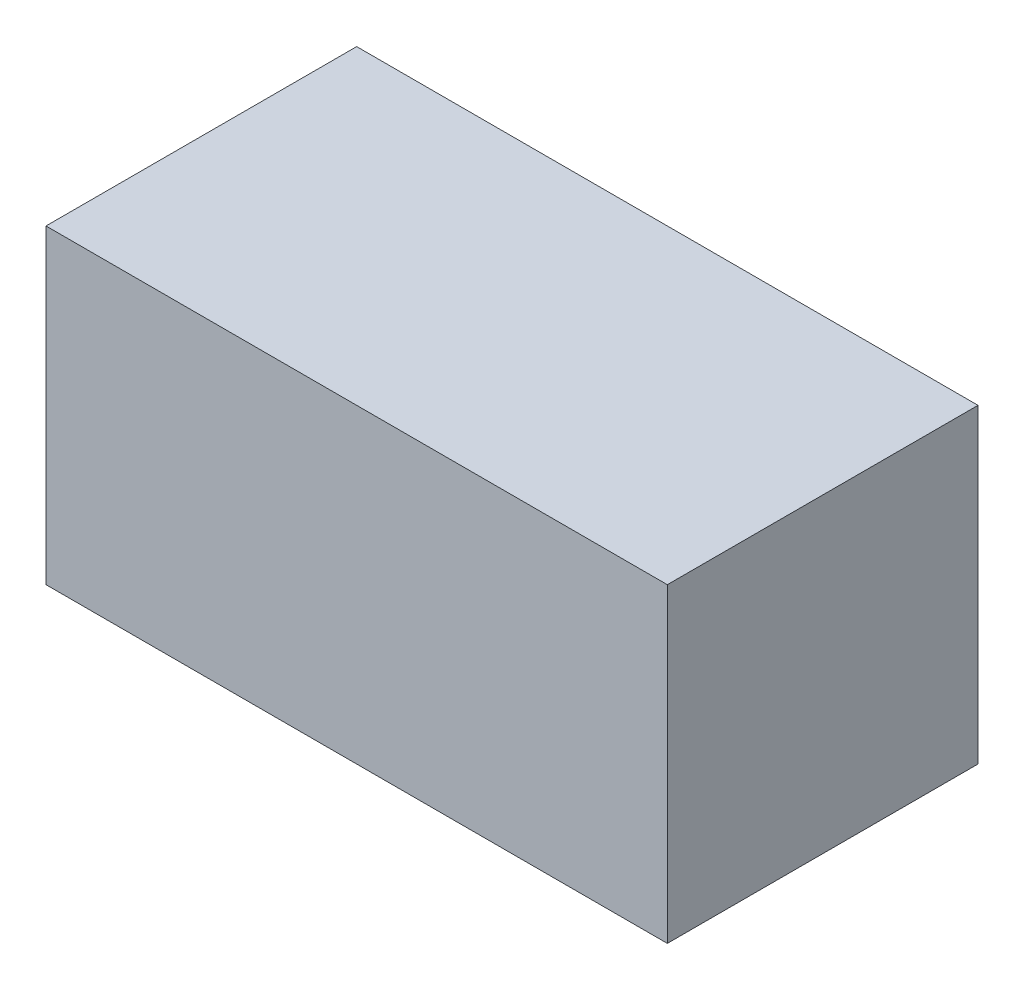
ISO-10303-21;
HEADER;
FILE_DESCRIPTION(('STEP AP214'),'2;1');
FILE_NAME('part.step','',(''),(''),'','','');
FILE_SCHEMA(('AUTOMOTIVE_DESIGN { 1 0 10303 214 1 1 1 1 }'));
ENDSEC;
DATA;
#1=APPLICATION_CONTEXT('core data for automotive mechanical design processes');
#2=APPLICATION_PROTOCOL_DEFINITION('international standard','automotive_design',2000,#1);
#3=PRODUCT_CONTEXT('',#1,'mechanical');
#4=PRODUCT('Part','Part','',(#3));
#5=PRODUCT_RELATED_PRODUCT_CATEGORY('part','',(#4));
#6=PRODUCT_DEFINITION_FORMATION('','',#4);
#7=PRODUCT_DEFINITION_CONTEXT('part definition',#1,'design');
#8=PRODUCT_DEFINITION('design','',#6,#7);
#9=PRODUCT_DEFINITION_SHAPE('','',#8);
#10=(LENGTH_UNIT() NAMED_UNIT(*) SI_UNIT(.MILLI.,.METRE.));
#11=(NAMED_UNIT(*) PLANE_ANGLE_UNIT() SI_UNIT($,.RADIAN.));
#12=(NAMED_UNIT(*) SI_UNIT($,.STERADIAN.) SOLID_ANGLE_UNIT());
#13=UNCERTAINTY_MEASURE_WITH_UNIT(LENGTH_MEASURE(1.E-05),#10,'distance_accuracy_value','');
#14=(GEOMETRIC_REPRESENTATION_CONTEXT(3) GLOBAL_UNCERTAINTY_ASSIGNED_CONTEXT((#13)) GLOBAL_UNIT_ASSIGNED_CONTEXT((#10,
#11,#12)) REPRESENTATION_CONTEXT('',''));
#15=CARTESIAN_POINT('',(0.,0.,0.));
#16=DIRECTION('',(0.,0.,1.));
#17=DIRECTION('',(1.,0.,0.));
#18=AXIS2_PLACEMENT_3D('',#15,#16,#17);
#19=CARTESIAN_POINT('',(6.35,-3.175,6.35));
#20=DIRECTION('',(-1.,0.,0.));
#21=DIRECTION('',(0.,0.,1.));
#22=AXIS2_PLACEMENT_3D('',#19,#20,#21);
#23=PLANE('',#22);
#24=DIRECTION('',(0.,1.,0.));
#25=VECTOR('',#24,1.);
#26=CARTESIAN_POINT('',(6.35,-3.175,0.));
#27=LINE('',#26,#25);
#28=CARTESIAN_POINT('',(6.35,-3.175,0.));
#29=VERTEX_POINT('',#28);
#30=CARTESIAN_POINT('',(6.35,3.175,0.));
#31=VERTEX_POINT('',#30);
#32=EDGE_CURVE('E96',#29,#31,#27,.T.);
#33=ORIENTED_EDGE('',*,*,#32,.T.);
#34=DIRECTION('',(0.,0.,-1.));
#35=VECTOR('',#34,1.);
#36=CARTESIAN_POINT('',(6.35,3.175,6.35));
#37=LINE('',#36,#35);
#38=CARTESIAN_POINT('',(6.35,3.175,6.35));
#39=VERTEX_POINT('',#38);
#40=EDGE_CURVE('E11',#39,#31,#37,.T.);
#41=ORIENTED_EDGE('',*,*,#40,.F.);
#42=DIRECTION('',(0.,1.,0.));
#43=VECTOR('',#42,1.);
#44=CARTESIAN_POINT('',(6.35,-3.175,6.35));
#45=LINE('',#44,#43);
#46=CARTESIAN_POINT('',(6.35,-3.175,6.35));
#47=VERTEX_POINT('',#46);
#48=EDGE_CURVE('E84',#47,#39,#45,.T.);
#49=ORIENTED_EDGE('',*,*,#48,.F.);
#50=DIRECTION('',(0.,0.,-1.));
#51=VECTOR('',#50,1.);
#52=CARTESIAN_POINT('',(6.35,-3.175,6.35));
#53=LINE('',#52,#51);
#54=EDGE_CURVE('E92',#47,#29,#53,.T.);
#55=ORIENTED_EDGE('',*,*,#54,.T.);
#56=EDGE_LOOP('',(#33,#41,#49,#55));
#57=FACE_BOUND('',#56,.T.);
#58=ADVANCED_FACE('F33',(#57),#23,.F.);
#59=CARTESIAN_POINT('',(-6.35,3.175,6.35));
#60=DIRECTION('',(0.,-1.,0.));
#61=DIRECTION('',(0.,0.,-1.));
#62=AXIS2_PLACEMENT_3D('',#59,#60,#61);
#63=PLANE('',#62);
#64=DIRECTION('',(-1.,0.,0.));
#65=VECTOR('',#64,1.);
#66=CARTESIAN_POINT('',(-6.35,3.175,0.));
#67=LINE('',#66,#65);
#68=CARTESIAN_POINT('',(-6.35,3.175,0.));
#69=VERTEX_POINT('',#68);
#70=EDGE_CURVE('E88',#31,#69,#67,.T.);
#71=ORIENTED_EDGE('',*,*,#70,.T.);
#72=DIRECTION('',(0.,0.,-1.));
#73=VECTOR('',#72,1.);
#74=CARTESIAN_POINT('',(-6.35,3.175,6.35));
#75=LINE('',#74,#73);
#76=CARTESIAN_POINT('',(-6.35,3.175,6.35));
#77=VERTEX_POINT('',#76);
#78=EDGE_CURVE('E41',#77,#69,#75,.T.);
#79=ORIENTED_EDGE('',*,*,#78,.F.);
#80=DIRECTION('',(-1.,0.,0.));
#81=VECTOR('',#80,1.);
#82=CARTESIAN_POINT('',(-6.35,3.175,6.35));
#83=LINE('',#82,#81);
#84=EDGE_CURVE('E79',#39,#77,#83,.T.);
#85=ORIENTED_EDGE('',*,*,#84,.F.);
#86=ORIENTED_EDGE('',*,*,#40,.T.);
#87=EDGE_LOOP('',(#71,#79,#85,#86));
#88=FACE_BOUND('',#87,.T.);
#89=ADVANCED_FACE('F87',(#88),#63,.F.);
#90=CARTESIAN_POINT('',(-6.35,-3.175,6.35));
#91=DIRECTION('',(1.,0.,0.));
#92=DIRECTION('',(0.,0.,-1.));
#93=AXIS2_PLACEMENT_3D('',#90,#91,#92);
#94=PLANE('',#93);
#95=DIRECTION('',(0.,-1.,0.));
#96=VECTOR('',#95,1.);
#97=CARTESIAN_POINT('',(-6.35,-3.175,0.));
#98=LINE('',#97,#96);
#99=CARTESIAN_POINT('',(-6.35,-3.175,0.));
#100=VERTEX_POINT('',#99);
#101=EDGE_CURVE('E66',#69,#100,#98,.T.);
#102=ORIENTED_EDGE('',*,*,#101,.T.);
#103=DIRECTION('',(0.,0.,-1.));
#104=VECTOR('',#103,1.);
#105=CARTESIAN_POINT('',(-6.35,-3.175,6.35));
#106=LINE('',#105,#104);
#107=CARTESIAN_POINT('',(-6.35,-3.175,6.35));
#108=VERTEX_POINT('',#107);
#109=EDGE_CURVE('E89',#108,#100,#106,.T.);
#110=ORIENTED_EDGE('',*,*,#109,.F.);
#111=DIRECTION('',(0.,-1.,0.));
#112=VECTOR('',#111,1.);
#113=CARTESIAN_POINT('',(-6.35,-3.175,6.35));
#114=LINE('',#113,#112);
#115=EDGE_CURVE('E82',#77,#108,#114,.T.);
#116=ORIENTED_EDGE('',*,*,#115,.F.);
#117=ORIENTED_EDGE('',*,*,#78,.T.);
#118=EDGE_LOOP('',(#102,#110,#116,#117));
#119=FACE_BOUND('',#118,.T.);
#120=ADVANCED_FACE('F90',(#119),#94,.F.);
#121=CARTESIAN_POINT('',(-6.35,-3.175,6.35));
#122=DIRECTION('',(0.,1.,0.));
#123=DIRECTION('',(0.,0.,1.));
#124=AXIS2_PLACEMENT_3D('',#121,#122,#123);
#125=PLANE('',#124);
#126=DIRECTION('',(1.,0.,0.));
#127=VECTOR('',#126,1.);
#128=CARTESIAN_POINT('',(-6.35,-3.175,0.));
#129=LINE('',#128,#127);
#130=EDGE_CURVE('E72',#100,#29,#129,.T.);
#131=ORIENTED_EDGE('',*,*,#130,.T.);
#132=ORIENTED_EDGE('',*,*,#54,.F.);
#133=DIRECTION('',(1.,0.,0.));
#134=VECTOR('',#133,1.);
#135=CARTESIAN_POINT('',(-6.35,-3.175,6.35));
#136=LINE('',#135,#134);
#137=EDGE_CURVE('E49',#108,#47,#136,.T.);
#138=ORIENTED_EDGE('',*,*,#137,.F.);
#139=ORIENTED_EDGE('',*,*,#109,.T.);
#140=EDGE_LOOP('',(#131,#132,#138,#139));
#141=FACE_BOUND('',#140,.T.);
#142=ADVANCED_FACE('F103',(#141),#125,.F.);
#143=CARTESIAN_POINT('',(6.35,3.175,6.35));
#144=DIRECTION('',(0.,0.,-1.));
#145=DIRECTION('',(-1.,0.,0.));
#146=AXIS2_PLACEMENT_3D('',#143,#144,#145);
#147=PLANE('',#146);
#148=ORIENTED_EDGE('',*,*,#48,.T.);
#149=ORIENTED_EDGE('',*,*,#84,.T.);
#150=ORIENTED_EDGE('',*,*,#115,.T.);
#151=ORIENTED_EDGE('',*,*,#137,.T.);
#152=EDGE_LOOP('',(#148,#149,#150,#151));
#153=FACE_BOUND('',#152,.T.);
#154=ADVANCED_FACE('F80',(#153),#147,.F.);
#155=CARTESIAN_POINT('',(6.35,3.175,0.));
#156=DIRECTION('',(0.,0.,-1.));
#157=DIRECTION('',(-1.,0.,0.));
#158=AXIS2_PLACEMENT_3D('',#155,#156,#157);
#159=PLANE('',#158);
#160=ORIENTED_EDGE('',*,*,#32,.F.);
#161=ORIENTED_EDGE('',*,*,#130,.F.);
#162=ORIENTED_EDGE('',*,*,#101,.F.);
#163=ORIENTED_EDGE('',*,*,#70,.F.);
#164=EDGE_LOOP('',(#160,#161,#162,#163));
#165=FACE_BOUND('',#164,.T.);
#166=ADVANCED_FACE('F106',(#165),#159,.T.);
#167=CLOSED_SHELL('',(#58,#89,#120,#142,#154,#166));
#168=MANIFOLD_SOLID_BREP('B2',#167);
#169=ADVANCED_BREP_SHAPE_REPRESENTATION('',(#18,#168),#14);
#170=SHAPE_DEFINITION_REPRESENTATION(#9,#169);
ENDSEC;
END-ISO-10303-21;
